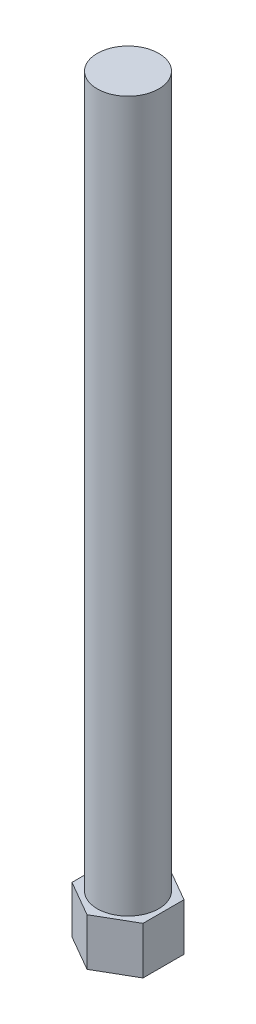
ISO-10303-21;
HEADER;
FILE_DESCRIPTION(('STEP AP214'),'2;1');
FILE_NAME('part.step','',(''),(''),'','','');
FILE_SCHEMA(('AUTOMOTIVE_DESIGN { 1 0 10303 214 1 1 1 1 }'));
ENDSEC;
DATA;
#1=APPLICATION_CONTEXT('core data for automotive mechanical design processes');
#2=APPLICATION_PROTOCOL_DEFINITION('international standard','automotive_design',2000,#1);
#3=PRODUCT_CONTEXT('',#1,'mechanical');
#4=PRODUCT('Part','Part','',(#3));
#5=PRODUCT_RELATED_PRODUCT_CATEGORY('part','',(#4));
#6=PRODUCT_DEFINITION_FORMATION('','',#4);
#7=PRODUCT_DEFINITION_CONTEXT('part definition',#1,'design');
#8=PRODUCT_DEFINITION('design','',#6,#7);
#9=PRODUCT_DEFINITION_SHAPE('','',#8);
#10=(LENGTH_UNIT() NAMED_UNIT(*) SI_UNIT(.MILLI.,.METRE.));
#11=(NAMED_UNIT(*) PLANE_ANGLE_UNIT() SI_UNIT($,.RADIAN.));
#12=(NAMED_UNIT(*) SI_UNIT($,.STERADIAN.) SOLID_ANGLE_UNIT());
#13=UNCERTAINTY_MEASURE_WITH_UNIT(LENGTH_MEASURE(1.E-05),#10,'distance_accuracy_value','');
#14=(GEOMETRIC_REPRESENTATION_CONTEXT(3) GLOBAL_UNCERTAINTY_ASSIGNED_CONTEXT((#13)) GLOBAL_UNIT_ASSIGNED_CONTEXT((#10,
#11,#12)) REPRESENTATION_CONTEXT('',''));
#15=CARTESIAN_POINT('',(0.,0.,0.));
#16=DIRECTION('',(0.,0.,1.));
#17=DIRECTION('',(1.,0.,0.));
#18=AXIS2_PLACEMENT_3D('',#15,#16,#17);
#19=CARTESIAN_POINT('',(0.,0.2,0.173205080756888));
#20=DIRECTION('',(-0.5,0.,-0.866025403784439));
#21=DIRECTION('',(-0.866025403784439,0.,0.5));
#22=AXIS2_PLACEMENT_3D('',#19,#20,#21);
#23=PLANE('',#22);
#24=DIRECTION('',(0.866025403784439,0.,-0.5));
#25=VECTOR('',#24,1.);
#26=CARTESIAN_POINT('',(0.,0.,0.173205080756888));
#27=LINE('',#26,#25);
#28=CARTESIAN_POINT('',(0.,0.,0.173205080756888));
#29=VERTEX_POINT('',#28);
#30=CARTESIAN_POINT('',(0.15,0.,0.0866025403784439));
#31=VERTEX_POINT('',#30);
#32=EDGE_CURVE('E123',#29,#31,#27,.T.);
#33=ORIENTED_EDGE('',*,*,#32,.T.);
#34=DIRECTION('',(0.,-1.,0.));
#35=VECTOR('',#34,1.);
#36=CARTESIAN_POINT('',(0.15,0.2,0.0866025403784439));
#37=LINE('',#36,#35);
#38=CARTESIAN_POINT('',(0.15,0.2,0.0866025403784439));
#39=VERTEX_POINT('',#38);
#40=EDGE_CURVE('E40',#39,#31,#37,.T.);
#41=ORIENTED_EDGE('',*,*,#40,.F.);
#42=DIRECTION('',(0.866025403784439,0.,-0.5));
#43=VECTOR('',#42,1.);
#44=CARTESIAN_POINT('',(0.,0.2,0.173205080756888));
#45=LINE('',#44,#43);
#46=CARTESIAN_POINT('',(0.,0.2,0.173205080756888));
#47=VERTEX_POINT('',#46);
#48=EDGE_CURVE('E134',#47,#39,#45,.T.);
#49=ORIENTED_EDGE('',*,*,#48,.F.);
#50=DIRECTION('',(0.,-1.,0.));
#51=VECTOR('',#50,1.);
#52=CARTESIAN_POINT('',(0.,0.2,0.173205080756888));
#53=LINE('',#52,#51);
#54=EDGE_CURVE('E119',#47,#29,#53,.T.);
#55=ORIENTED_EDGE('',*,*,#54,.T.);
#56=EDGE_LOOP('',(#33,#41,#49,#55));
#57=FACE_BOUND('',#56,.T.);
#58=ADVANCED_FACE('F37',(#57),#23,.F.);
#59=CARTESIAN_POINT('',(0.15,0.2,0.0866025403784439));
#60=DIRECTION('',(-1.,0.,0.));
#61=DIRECTION('',(0.,0.,1.));
#62=AXIS2_PLACEMENT_3D('',#59,#60,#61);
#63=PLANE('',#62);
#64=DIRECTION('',(0.,0.,-1.));
#65=VECTOR('',#64,1.);
#66=CARTESIAN_POINT('',(0.15,0.,0.0866025403784439));
#67=LINE('',#66,#65);
#68=CARTESIAN_POINT('',(0.15,0.,-0.0866025403784438));
#69=VERTEX_POINT('',#68);
#70=EDGE_CURVE('E126',#31,#69,#67,.T.);
#71=ORIENTED_EDGE('',*,*,#70,.T.);
#72=DIRECTION('',(0.,-1.,0.));
#73=VECTOR('',#72,1.);
#74=CARTESIAN_POINT('',(0.15,0.2,-0.0866025403784438));
#75=LINE('',#74,#73);
#76=CARTESIAN_POINT('',(0.15,0.2,-0.0866025403784438));
#77=VERTEX_POINT('',#76);
#78=EDGE_CURVE('E137',#77,#69,#75,.T.);
#79=ORIENTED_EDGE('',*,*,#78,.F.);
#80=DIRECTION('',(0.,0.,-1.));
#81=VECTOR('',#80,1.);
#82=CARTESIAN_POINT('',(0.15,0.2,0.0866025403784439));
#83=LINE('',#82,#81);
#84=EDGE_CURVE('E92',#39,#77,#83,.T.);
#85=ORIENTED_EDGE('',*,*,#84,.F.);
#86=ORIENTED_EDGE('',*,*,#40,.T.);
#87=EDGE_LOOP('',(#71,#79,#85,#86));
#88=FACE_BOUND('',#87,.T.);
#89=ADVANCED_FACE('F142',(#88),#63,.F.);
#90=CARTESIAN_POINT('',(0.15,0.2,-0.0866025403784438));
#91=DIRECTION('',(-0.5,0.,0.866025403784438));
#92=DIRECTION('',(0.866025403784439,0.,0.5));
#93=AXIS2_PLACEMENT_3D('',#90,#91,#92);
#94=PLANE('',#93);
#95=DIRECTION('',(-0.866025403784438,0.,-0.5));
#96=VECTOR('',#95,1.);
#97=CARTESIAN_POINT('',(0.15,0.,-0.0866025403784438));
#98=LINE('',#97,#96);
#99=CARTESIAN_POINT('',(0.,0.,-0.173205080756888));
#100=VERTEX_POINT('',#99);
#101=EDGE_CURVE('E129',#69,#100,#98,.T.);
#102=ORIENTED_EDGE('',*,*,#101,.T.);
#103=DIRECTION('',(0.,-1.,0.));
#104=VECTOR('',#103,1.);
#105=CARTESIAN_POINT('',(0.,0.2,-0.173205080756888));
#106=LINE('',#105,#104);
#107=CARTESIAN_POINT('',(0.,0.2,-0.173205080756888));
#108=VERTEX_POINT('',#107);
#109=EDGE_CURVE('E114',#108,#100,#106,.T.);
#110=ORIENTED_EDGE('',*,*,#109,.F.);
#111=DIRECTION('',(-0.866025403784438,0.,-0.5));
#112=VECTOR('',#111,1.);
#113=CARTESIAN_POINT('',(0.15,0.2,-0.0866025403784438));
#114=LINE('',#113,#112);
#115=EDGE_CURVE('E105',#77,#108,#114,.T.);
#116=ORIENTED_EDGE('',*,*,#115,.F.);
#117=ORIENTED_EDGE('',*,*,#78,.T.);
#118=EDGE_LOOP('',(#102,#110,#116,#117));
#119=FACE_BOUND('',#118,.T.);
#120=ADVANCED_FACE('F148',(#119),#94,.F.);
#121=CARTESIAN_POINT('',(0.,0.2,-0.173205080756888));
#122=DIRECTION('',(0.5,0.,0.866025403784439));
#123=DIRECTION('',(0.866025403784439,0.,-0.5));
#124=AXIS2_PLACEMENT_3D('',#121,#122,#123);
#125=PLANE('',#124);
#126=DIRECTION('',(-0.866025403784439,0.,0.5));
#127=VECTOR('',#126,1.);
#128=CARTESIAN_POINT('',(0.,0.,-0.173205080756888));
#129=LINE('',#128,#127);
#130=CARTESIAN_POINT('',(-0.15,0.,-0.0866025403784439));
#131=VERTEX_POINT('',#130);
#132=EDGE_CURVE('E113',#100,#131,#129,.T.);
#133=ORIENTED_EDGE('',*,*,#132,.T.);
#134=DIRECTION('',(0.,-1.,0.));
#135=VECTOR('',#134,1.);
#136=CARTESIAN_POINT('',(-0.15,0.2,-0.0866025403784439));
#137=LINE('',#136,#135);
#138=CARTESIAN_POINT('',(-0.15,0.2,-0.0866025403784439));
#139=VERTEX_POINT('',#138);
#140=EDGE_CURVE('E110',#139,#131,#137,.T.);
#141=ORIENTED_EDGE('',*,*,#140,.F.);
#142=DIRECTION('',(-0.866025403784439,0.,0.5));
#143=VECTOR('',#142,1.);
#144=CARTESIAN_POINT('',(0.,0.2,-0.173205080756888));
#145=LINE('',#144,#143);
#146=EDGE_CURVE('E99',#108,#139,#145,.T.);
#147=ORIENTED_EDGE('',*,*,#146,.F.);
#148=ORIENTED_EDGE('',*,*,#109,.T.);
#149=EDGE_LOOP('',(#133,#141,#147,#148));
#150=FACE_BOUND('',#149,.T.);
#151=ADVANCED_FACE('F111',(#150),#125,.F.);
#152=CARTESIAN_POINT('',(-0.15,0.2,-0.0866025403784439));
#153=DIRECTION('',(1.,0.,0.));
#154=DIRECTION('',(0.,0.,-1.));
#155=AXIS2_PLACEMENT_3D('',#152,#153,#154);
#156=PLANE('',#155);
#157=DIRECTION('',(0.,0.,1.));
#158=VECTOR('',#157,1.);
#159=CARTESIAN_POINT('',(-0.15,0.,-0.0866025403784439));
#160=LINE('',#159,#158);
#161=CARTESIAN_POINT('',(-0.15,0.,0.0866025403784438));
#162=VERTEX_POINT('',#161);
#163=EDGE_CURVE('E77',#131,#162,#160,.T.);
#164=ORIENTED_EDGE('',*,*,#163,.T.);
#165=DIRECTION('',(0.,-1.,0.));
#166=VECTOR('',#165,1.);
#167=CARTESIAN_POINT('',(-0.15,0.2,0.0866025403784438));
#168=LINE('',#167,#166);
#169=CARTESIAN_POINT('',(-0.15,0.2,0.0866025403784438));
#170=VERTEX_POINT('',#169);
#171=EDGE_CURVE('E115',#170,#162,#168,.T.);
#172=ORIENTED_EDGE('',*,*,#171,.F.);
#173=DIRECTION('',(0.,0.,1.));
#174=VECTOR('',#173,1.);
#175=CARTESIAN_POINT('',(-0.15,0.2,-0.0866025403784439));
#176=LINE('',#175,#174);
#177=EDGE_CURVE('E103',#139,#170,#176,.T.);
#178=ORIENTED_EDGE('',*,*,#177,.F.);
#179=ORIENTED_EDGE('',*,*,#140,.T.);
#180=EDGE_LOOP('',(#164,#172,#178,#179));
#181=FACE_BOUND('',#180,.T.);
#182=ADVANCED_FACE('F117',(#181),#156,.F.);
#183=CARTESIAN_POINT('',(-0.15,0.2,0.0866025403784438));
#184=DIRECTION('',(0.5,0.,-0.866025403784438));
#185=DIRECTION('',(-0.866025403784438,0.,-0.5));
#186=AXIS2_PLACEMENT_3D('',#183,#184,#185);
#187=PLANE('',#186);
#188=DIRECTION('',(0.866025403784438,0.,0.5));
#189=VECTOR('',#188,1.);
#190=CARTESIAN_POINT('',(-0.15,0.,0.0866025403784438));
#191=LINE('',#190,#189);
#192=EDGE_CURVE('E83',#162,#29,#191,.T.);
#193=ORIENTED_EDGE('',*,*,#192,.T.);
#194=ORIENTED_EDGE('',*,*,#54,.F.);
#195=DIRECTION('',(0.866025403784438,0.,0.5));
#196=VECTOR('',#195,1.);
#197=CARTESIAN_POINT('',(-0.15,0.2,0.0866025403784438));
#198=LINE('',#197,#196);
#199=EDGE_CURVE('E54',#170,#47,#198,.T.);
#200=ORIENTED_EDGE('',*,*,#199,.F.);
#201=ORIENTED_EDGE('',*,*,#171,.T.);
#202=EDGE_LOOP('',(#193,#194,#200,#201));
#203=FACE_BOUND('',#202,.T.);
#204=ADVANCED_FACE('F164',(#203),#187,.F.);
#205=CARTESIAN_POINT('',(0.,0.2,0.));
#206=DIRECTION('',(0.,1.,0.));
#207=DIRECTION('',(0.,0.,1.));
#208=AXIS2_PLACEMENT_3D('',#205,#206,#207);
#209=PLANE('',#208);
#210=CARTESIAN_POINT('',(0.,0.2,0.));
#211=DIRECTION('',(0.,1.,0.));
#212=DIRECTION('',(0.,0.,1.));
#213=AXIS2_PLACEMENT_3D('',#210,#211,#212);
#214=CIRCLE('',#213,0.13);
#215=CARTESIAN_POINT('',(0.,0.2,0.13));
#216=VERTEX_POINT('',#215);
#217=EDGE_CURVE('E11',#216,#216,#214,.T.);
#218=ORIENTED_EDGE('',*,*,#217,.F.);
#219=EDGE_LOOP('',(#218));
#220=FACE_BOUND('',#219,.T.);
#221=ORIENTED_EDGE('',*,*,#48,.T.);
#222=ORIENTED_EDGE('',*,*,#84,.T.);
#223=ORIENTED_EDGE('',*,*,#115,.T.);
#224=ORIENTED_EDGE('',*,*,#146,.T.);
#225=ORIENTED_EDGE('',*,*,#177,.T.);
#226=ORIENTED_EDGE('',*,*,#199,.T.);
#227=EDGE_LOOP('',(#221,#222,#223,#224,#225,#226));
#228=FACE_BOUND('',#227,.T.);
#229=ADVANCED_FACE('F101',(#220,#228),#209,.T.);
#230=CARTESIAN_POINT('',(0.,0.,0.));
#231=DIRECTION('',(0.,1.,0.));
#232=DIRECTION('',(0.,0.,1.));
#233=AXIS2_PLACEMENT_3D('',#230,#231,#232);
#234=PLANE('',#233);
#235=ORIENTED_EDGE('',*,*,#32,.F.);
#236=ORIENTED_EDGE('',*,*,#192,.F.);
#237=ORIENTED_EDGE('',*,*,#163,.F.);
#238=ORIENTED_EDGE('',*,*,#132,.F.);
#239=ORIENTED_EDGE('',*,*,#101,.F.);
#240=ORIENTED_EDGE('',*,*,#70,.F.);
#241=EDGE_LOOP('',(#235,#236,#237,#238,#239,#240));
#242=FACE_BOUND('',#241,.T.);
#243=ADVANCED_FACE('F147',(#242),#234,.F.);
#244=CARTESIAN_POINT('',(0.,3.2,0.));
#245=DIRECTION('',(0.,-1.,0.));
#246=DIRECTION('',(0.,0.,-1.));
#247=AXIS2_PLACEMENT_3D('',#244,#245,#246);
#248=CYLINDRICAL_SURFACE('',#247,0.13);
#249=CARTESIAN_POINT('',(0.,3.2,0.));
#250=DIRECTION('',(0.,1.,0.));
#251=DIRECTION('',(0.,0.,1.));
#252=AXIS2_PLACEMENT_3D('',#249,#250,#251);
#253=CIRCLE('',#252,0.13);
#254=CARTESIAN_POINT('',(0.,3.2,0.13));
#255=VERTEX_POINT('',#254);
#256=EDGE_CURVE('E127',#255,#255,#253,.T.);
#257=ORIENTED_EDGE('',*,*,#256,.F.);
#258=EDGE_LOOP('',(#257));
#259=FACE_BOUND('',#258,.T.);
#260=ORIENTED_EDGE('',*,*,#217,.T.);
#261=EDGE_LOOP('',(#260));
#262=FACE_BOUND('',#261,.T.);
#263=ADVANCED_FACE('F157',(#259,#262),#248,.T.);
#264=CARTESIAN_POINT('',(0.,3.2,0.));
#265=DIRECTION('',(0.,1.,0.));
#266=DIRECTION('',(0.,0.,1.));
#267=AXIS2_PLACEMENT_3D('',#264,#265,#266);
#268=PLANE('',#267);
#269=ORIENTED_EDGE('',*,*,#256,.T.);
#270=EDGE_LOOP('',(#269));
#271=FACE_BOUND('',#270,.T.);
#272=ADVANCED_FACE('F155',(#271),#268,.T.);
#273=CLOSED_SHELL('',(#58,#89,#120,#151,#182,#204,#229,#243,#263,#272));
#274=MANIFOLD_SOLID_BREP('B2',#273);
#275=ADVANCED_BREP_SHAPE_REPRESENTATION('',(#18,#274),#14);
#276=SHAPE_DEFINITION_REPRESENTATION(#9,#275);
ENDSEC;
END-ISO-10303-21;
